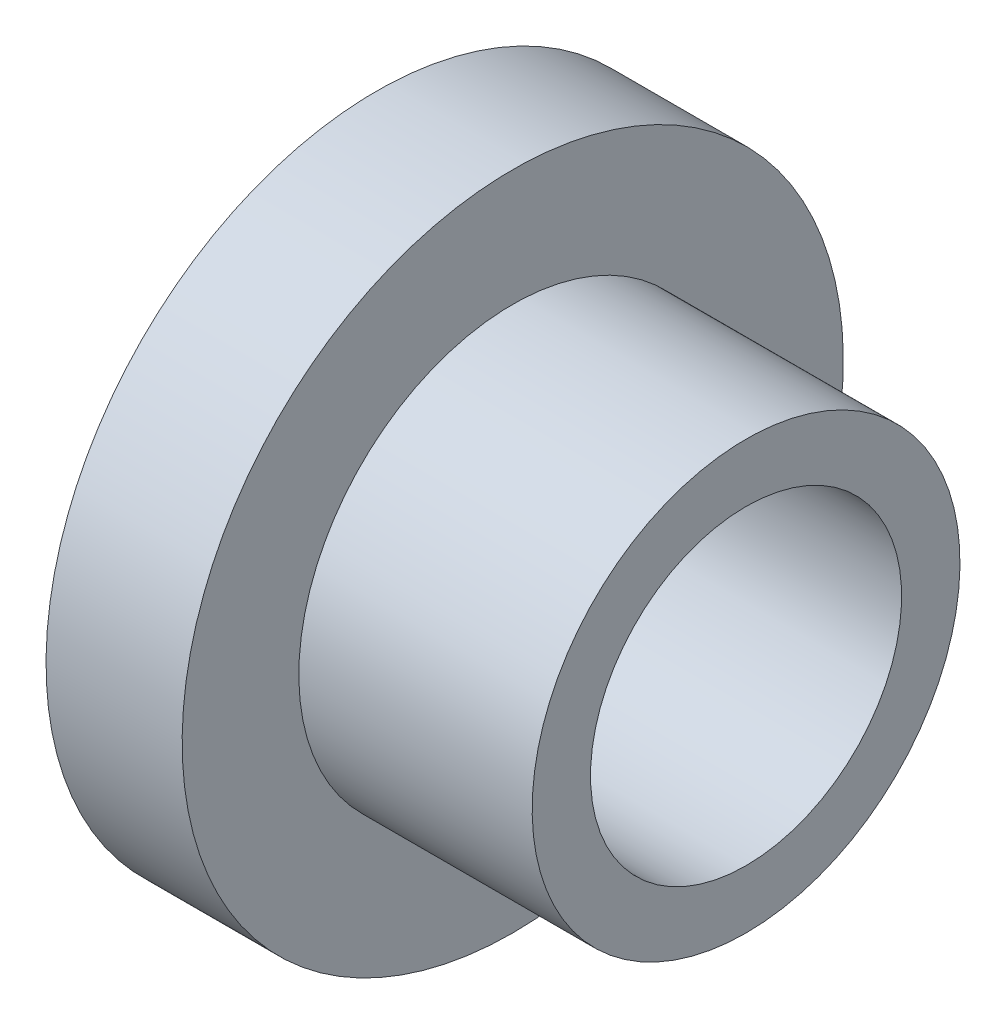
ISO-10303-21;
HEADER;
FILE_DESCRIPTION(('STEP AP214'),'2;1');
FILE_NAME('part.step','',(''),(''),'','','');
FILE_SCHEMA(('AUTOMOTIVE_DESIGN { 1 0 10303 214 1 1 1 1 }'));
ENDSEC;
DATA;
#1=APPLICATION_CONTEXT('core data for automotive mechanical design processes');
#2=APPLICATION_PROTOCOL_DEFINITION('international standard','automotive_design',2000,#1);
#3=PRODUCT_CONTEXT('',#1,'mechanical');
#4=PRODUCT('Part','Part','',(#3));
#5=PRODUCT_RELATED_PRODUCT_CATEGORY('part','',(#4));
#6=PRODUCT_DEFINITION_FORMATION('','',#4);
#7=PRODUCT_DEFINITION_CONTEXT('part definition',#1,'design');
#8=PRODUCT_DEFINITION('design','',#6,#7);
#9=PRODUCT_DEFINITION_SHAPE('','',#8);
#10=(LENGTH_UNIT() NAMED_UNIT(*) SI_UNIT(.MILLI.,.METRE.));
#11=(NAMED_UNIT(*) PLANE_ANGLE_UNIT() SI_UNIT($,.RADIAN.));
#12=(NAMED_UNIT(*) SI_UNIT($,.STERADIAN.) SOLID_ANGLE_UNIT());
#13=UNCERTAINTY_MEASURE_WITH_UNIT(LENGTH_MEASURE(1.E-05),#10,'distance_accuracy_value','');
#14=(GEOMETRIC_REPRESENTATION_CONTEXT(3) GLOBAL_UNCERTAINTY_ASSIGNED_CONTEXT((#13)) GLOBAL_UNIT_ASSIGNED_CONTEXT((#10,
#11,#12)) REPRESENTATION_CONTEXT('',''));
#15=CARTESIAN_POINT('',(0.,0.,0.));
#16=DIRECTION('',(0.,0.,1.));
#17=DIRECTION('',(1.,0.,0.));
#18=AXIS2_PLACEMENT_3D('',#15,#16,#17);
#19=CARTESIAN_POINT('',(-12.4999999999997,0.,0.));
#20=DIRECTION('',(-0.999999999999981,0.,0.));
#21=DIRECTION('',(0.,-1.,0.));
#22=AXIS2_PLACEMENT_3D('',#19,#20,#21);
#23=CYLINDRICAL_SURFACE('',#22,8.);
#24=CARTESIAN_POINT('',(-9.49999999999971,0.,0.));
#25=DIRECTION('',(-0.999999999999981,0.,0.));
#26=DIRECTION('',(0.,-1.,0.));
#27=AXIS2_PLACEMENT_3D('',#24,#25,#26);
#28=CIRCLE('',#27,8.);
#29=CARTESIAN_POINT('',(-9.49999999999971,-8.,0.));
#30=VERTEX_POINT('',#29);
#31=EDGE_CURVE('E48',#30,#30,#28,.T.);
#32=CARTESIAN_POINT('',(9.49999999999999,5.96744875736022E-13,0.));
#33=DIRECTION('',(-0.999999999999981,0.,0.));
#34=DIRECTION('',(0.,-1.,0.));
#35=AXIS2_PLACEMENT_3D('',#32,#33,#34);
#36=CIRCLE('',#35,8.);
#37=CARTESIAN_POINT('',(9.5,-8.,0.));
#38=VERTEX_POINT('',#37);
#39=EDGE_CURVE('E10',#38,#38,#36,.T.);
#40=CARTESIAN_POINT('',(-9.49999999999971,-8.,0.));
#41=CARTESIAN_POINT('',(-9.30208333333304,-8.,0.));
#42=CARTESIAN_POINT('',(-9.10416666666638,-8.,0.));
#43=CARTESIAN_POINT('',(-8.70833333333305,-8.,0.));
#44=CARTESIAN_POINT('',(-8.51041666666639,-8.,0.));
#45=CARTESIAN_POINT('',(-8.11458333333306,-8.,0.));
#46=CARTESIAN_POINT('',(-7.9166666666664,-8.,0.));
#47=CARTESIAN_POINT('',(-7.52083333333307,-8.,0.));
#48=CARTESIAN_POINT('',(-7.32291666666641,-8.,0.));
#49=CARTESIAN_POINT('',(-6.92708333333308,-8.,0.));
#50=CARTESIAN_POINT('',(-6.72916666666642,-8.,0.));
#51=CARTESIAN_POINT('',(-6.33333333333309,-8.,0.));
#52=CARTESIAN_POINT('',(-6.13541666666642,-8.,0.));
#53=CARTESIAN_POINT('',(-5.7395833333331,-8.,0.));
#54=CARTESIAN_POINT('',(-5.54166666666643,-8.,0.));
#55=CARTESIAN_POINT('',(-5.14583333333311,-8.,0.));
#56=CARTESIAN_POINT('',(-4.94791666666644,-8.,0.));
#57=CARTESIAN_POINT('',(-4.55208333333312,-8.,0.));
#58=CARTESIAN_POINT('',(-4.35416666666645,-8.,0.));
#59=CARTESIAN_POINT('',(-3.95833333333313,-8.,0.));
#60=CARTESIAN_POINT('',(-3.76041666666646,-8.,0.));
#61=CARTESIAN_POINT('',(-3.36458333333313,-8.,0.));
#62=CARTESIAN_POINT('',(-3.16666666666647,-8.,0.));
#63=CARTESIAN_POINT('',(-2.77083333333314,-8.,0.));
#64=CARTESIAN_POINT('',(-2.57291666666648,-8.,0.));
#65=CARTESIAN_POINT('',(-2.17708333333315,-8.,0.));
#66=CARTESIAN_POINT('',(-1.97916666666649,-8.,0.));
#67=CARTESIAN_POINT('',(-1.58333333333316,-8.,0.));
#68=CARTESIAN_POINT('',(-1.3854166666665,-8.,0.));
#69=CARTESIAN_POINT('',(-0.989583333333173,-8.,0.));
#70=CARTESIAN_POINT('',(-0.791666666666509,-8.,0.));
#71=CARTESIAN_POINT('',(-0.395833333333182,-8.,0.));
#72=CARTESIAN_POINT('',(-0.197916666666519,-8.,0.));
#73=CARTESIAN_POINT('',(0.197916666666808,-8.,0.));
#74=CARTESIAN_POINT('',(0.395833333333473,-8.,0.));
#75=CARTESIAN_POINT('',(0.7916666666668,-8.,0.));
#76=CARTESIAN_POINT('',(0.989583333333463,-8.,0.));
#77=CARTESIAN_POINT('',(1.38541666666679,-8.,0.));
#78=CARTESIAN_POINT('',(1.58333333333345,-8.,0.));
#79=CARTESIAN_POINT('',(1.97916666666678,-8.,0.));
#80=CARTESIAN_POINT('',(2.17708333333345,-8.,0.));
#81=CARTESIAN_POINT('',(2.57291666666677,-8.,0.));
#82=CARTESIAN_POINT('',(2.77083333333343,-8.,0.));
#83=CARTESIAN_POINT('',(3.16666666666676,-8.,0.));
#84=CARTESIAN_POINT('',(3.36458333333343,-8.,0.));
#85=CARTESIAN_POINT('',(3.76041666666675,-8.,0.));
#86=CARTESIAN_POINT('',(3.95833333333342,-8.,0.));
#87=CARTESIAN_POINT('',(4.35416666666674,-8.,0.));
#88=CARTESIAN_POINT('',(4.55208333333341,-8.,0.));
#89=CARTESIAN_POINT('',(4.94791666666674,-8.,0.));
#90=CARTESIAN_POINT('',(5.1458333333334,-8.,0.));
#91=CARTESIAN_POINT('',(5.54166666666673,-8.,0.));
#92=CARTESIAN_POINT('',(5.73958333333339,-8.,0.));
#93=CARTESIAN_POINT('',(6.13541666666672,-8.,0.));
#94=CARTESIAN_POINT('',(6.33333333333338,-8.,0.));
#95=CARTESIAN_POINT('',(6.72916666666671,-8.,0.));
#96=CARTESIAN_POINT('',(6.92708333333337,-8.,0.));
#97=CARTESIAN_POINT('',(7.3229166666667,-8.,0.));
#98=CARTESIAN_POINT('',(7.52083333333336,-8.,0.));
#99=CARTESIAN_POINT('',(7.91666666666669,-8.,0.));
#100=CARTESIAN_POINT('',(8.11458333333335,-8.,0.));
#101=CARTESIAN_POINT('',(8.51041666666668,-8.,0.));
#102=CARTESIAN_POINT('',(8.70833333333334,-8.,0.));
#103=CARTESIAN_POINT('',(9.10416666666667,-8.,0.));
#104=CARTESIAN_POINT('',(9.30208333333333,-8.,0.));
#105=CARTESIAN_POINT('',(9.5,-8.,0.));
#106=B_SPLINE_CURVE_WITH_KNOTS('',3,(#40,#41,#42,#43,#44,#45,#46,#47,#48,#49,#50,#51,#52,#53,
#54,#55,#56,#57,#58,#59,#60,#61,#62,#63,#64,#65,#66,#67,#68,#69,#70,#71,#72,#73,#74,#75,#76,#77,
#78,#79,#80,#81,#82,#83,#84,#85,#86,#87,#88,#89,#90,#91,#92,#93,#94,#95,#96,#97,#98,#99,#100,
#101,#102,#103,#104,#105),.UNSPECIFIED.,.F.,.F.,(4,2,2,2,2,2,2,2,2,2,2,2,2,2,2,2,2,2,2,2,2,2,2,
2,2,2,2,2,2,2,2,2,4),(0.,0.593749999999992,1.18749999999998,1.78124999999997,2.37499999999996,
2.96874999999996,3.56249999999995,4.15624999999994,4.74999999999993,5.34374999999992,
5.93749999999991,6.5312499999999,7.12499999999989,7.71874999999988,8.31249999999987,
8.90624999999986,9.49999999999985,10.0937499999998,10.6874999999998,11.2812499999998,
11.8749999999998,12.4687499999998,13.0624999999998,13.6562499999998,14.2499999999998,
14.8437499999998,15.4374999999998,16.0312499999997,16.6249999999997,17.2187499999997,
17.8124999999997,18.4062499999997,18.9999999999997),.UNSPECIFIED.);
#107=EDGE_CURVE('BSEAM26',#30,#38,#106,.T.);
#108=ORIENTED_EDGE('',*,*,#31,.T.);
#109=ORIENTED_EDGE('',*,*,#39,.F.);
#110=ORIENTED_EDGE('',*,*,#107,.T.);
#111=ORIENTED_EDGE('',*,*,#107,.F.);
#112=EDGE_LOOP('',(#108,#110,#109,#111));
#113=FACE_BOUND('',#112,.T.);
#114=ADVANCED_FACE('F26',(#113),#23,.F.);
#115=CARTESIAN_POINT('',(9.49999999999999,-7.9999999999997,0.));
#116=DIRECTION('',(0.999999999999981,0.,0.));
#117=DIRECTION('',(0.,1.,0.));
#118=AXIS2_PLACEMENT_3D('',#115,#116,#117);
#119=PLANE('',#118);
#120=ORIENTED_EDGE('',*,*,#39,.T.);
#121=EDGE_LOOP('',(#120));
#122=FACE_BOUND('',#121,.T.);
#123=CARTESIAN_POINT('',(9.49999999999999,5.96744875736022E-13,0.));
#124=DIRECTION('',(-0.999999999999981,0.,0.));
#125=DIRECTION('',(0.,-1.,0.));
#126=AXIS2_PLACEMENT_3D('',#123,#124,#125);
#127=CIRCLE('',#126,11.);
#128=CARTESIAN_POINT('',(9.5,-11.,0.));
#129=VERTEX_POINT('',#128);
#130=EDGE_CURVE('E32',#129,#129,#127,.T.);
#131=ORIENTED_EDGE('',*,*,#130,.F.);
#132=EDGE_LOOP('',(#131));
#133=FACE_BOUND('',#132,.T.);
#134=ADVANCED_FACE('F66',(#122,#133),#119,.T.);
#135=CARTESIAN_POINT('',(-12.4999999999997,0.,0.));
#136=DIRECTION('',(-0.999999999999981,0.,0.));
#137=DIRECTION('',(0.,-1.,0.));
#138=AXIS2_PLACEMENT_3D('',#135,#136,#137);
#139=CYLINDRICAL_SURFACE('',#138,11.);
#140=CARTESIAN_POINT('',(-2.5,0.,0.));
#141=DIRECTION('',(-0.999999999999981,0.,0.));
#142=DIRECTION('',(0.,-1.,0.));
#143=AXIS2_PLACEMENT_3D('',#140,#141,#142);
#144=CIRCLE('',#143,11.);
#145=CARTESIAN_POINT('',(-2.5,-11.,0.));
#146=VERTEX_POINT('',#145);
#147=EDGE_CURVE('E36',#146,#146,#144,.T.);
#148=CARTESIAN_POINT('',(9.5,-11.,0.));
#149=CARTESIAN_POINT('',(9.375,-11.,0.));
#150=CARTESIAN_POINT('',(9.25,-11.,0.));
#151=CARTESIAN_POINT('',(9.,-11.,0.));
#152=CARTESIAN_POINT('',(8.875,-11.,0.));
#153=CARTESIAN_POINT('',(8.62499999999999,-11.,0.));
#154=CARTESIAN_POINT('',(8.49999999999999,-11.,0.));
#155=CARTESIAN_POINT('',(8.24999999999999,-11.,0.));
#156=CARTESIAN_POINT('',(8.12499999999999,-11.,0.));
#157=CARTESIAN_POINT('',(7.87499999999999,-11.,0.));
#158=CARTESIAN_POINT('',(7.74999999999999,-11.,0.));
#159=CARTESIAN_POINT('',(7.49999999999999,-11.,0.));
#160=CARTESIAN_POINT('',(7.37499999999999,-11.,0.));
#161=CARTESIAN_POINT('',(7.12499999999999,-11.,0.));
#162=CARTESIAN_POINT('',(6.99999999999999,-11.,0.));
#163=CARTESIAN_POINT('',(6.74999999999999,-11.,0.));
#164=CARTESIAN_POINT('',(6.62499999999999,-11.,0.));
#165=CARTESIAN_POINT('',(6.37499999999999,-11.,0.));
#166=CARTESIAN_POINT('',(6.24999999999999,-11.,0.));
#167=CARTESIAN_POINT('',(6.,-11.,0.));
#168=CARTESIAN_POINT('',(5.875,-11.,0.));
#169=CARTESIAN_POINT('',(5.625,-11.,0.));
#170=CARTESIAN_POINT('',(5.5,-11.,0.));
#171=CARTESIAN_POINT('',(5.25,-11.,0.));
#172=CARTESIAN_POINT('',(5.125,-11.,0.));
#173=CARTESIAN_POINT('',(4.875,-11.,0.));
#174=CARTESIAN_POINT('',(4.75,-11.,0.));
#175=CARTESIAN_POINT('',(4.5,-11.,0.));
#176=CARTESIAN_POINT('',(4.375,-11.,0.));
#177=CARTESIAN_POINT('',(4.125,-11.,0.));
#178=CARTESIAN_POINT('',(4.,-11.,0.));
#179=CARTESIAN_POINT('',(3.75,-11.,0.));
#180=CARTESIAN_POINT('',(3.625,-11.,0.));
#181=CARTESIAN_POINT('',(3.375,-11.,0.));
#182=CARTESIAN_POINT('',(3.25,-11.,0.));
#183=CARTESIAN_POINT('',(3.,-11.,0.));
#184=CARTESIAN_POINT('',(2.875,-11.,0.));
#185=CARTESIAN_POINT('',(2.625,-11.,0.));
#186=CARTESIAN_POINT('',(2.5,-11.,0.));
#187=CARTESIAN_POINT('',(2.25,-11.,0.));
#188=CARTESIAN_POINT('',(2.125,-11.,0.));
#189=CARTESIAN_POINT('',(1.875,-11.,0.));
#190=CARTESIAN_POINT('',(1.75,-11.,0.));
#191=CARTESIAN_POINT('',(1.5,-11.,0.));
#192=CARTESIAN_POINT('',(1.375,-11.,0.));
#193=CARTESIAN_POINT('',(1.125,-11.,0.));
#194=CARTESIAN_POINT('',(0.999999999999999,-11.,0.));
#195=CARTESIAN_POINT('',(0.749999999999999,-11.,0.));
#196=CARTESIAN_POINT('',(0.624999999999999,-11.,0.));
#197=CARTESIAN_POINT('',(0.374999999999999,-11.,0.));
#198=CARTESIAN_POINT('',(0.249999999999999,-11.,0.));
#199=CARTESIAN_POINT('',(0.,-11.,0.));
#200=CARTESIAN_POINT('',(-0.125000000000002,-11.,0.));
#201=CARTESIAN_POINT('',(-0.375000000000002,-11.,0.));
#202=CARTESIAN_POINT('',(-0.500000000000002,-11.,0.));
#203=CARTESIAN_POINT('',(-0.750000000000002,-11.,0.));
#204=CARTESIAN_POINT('',(-0.875000000000001,-11.,0.));
#205=CARTESIAN_POINT('',(-1.125,-11.,0.));
#206=CARTESIAN_POINT('',(-1.25,-11.,0.));
#207=CARTESIAN_POINT('',(-1.5,-11.,0.));
#208=CARTESIAN_POINT('',(-1.625,-11.,0.));
#209=CARTESIAN_POINT('',(-1.875,-11.,0.));
#210=CARTESIAN_POINT('',(-2.,-11.,0.));
#211=CARTESIAN_POINT('',(-2.25,-11.,0.));
#212=CARTESIAN_POINT('',(-2.375,-11.,0.));
#213=CARTESIAN_POINT('',(-2.5,-11.,0.));
#214=B_SPLINE_CURVE_WITH_KNOTS('',3,(#148,#149,#150,#151,#152,#153,#154,#155,#156,#157,#158,
#159,#160,#161,#162,#163,#164,#165,#166,#167,#168,#169,#170,#171,#172,#173,#174,#175,#176,#177,
#178,#179,#180,#181,#182,#183,#184,#185,#186,#187,#188,#189,#190,#191,#192,#193,#194,#195,#196,
#197,#198,#199,#200,#201,#202,#203,#204,#205,#206,#207,#208,#209,#210,#211,#212,#213),
.UNSPECIFIED.,.F.,.F.,(4,2,2,2,2,2,2,2,2,2,2,2,2,2,2,2,2,2,2,2,2,2,2,2,2,2,2,2,2,2,2,2,4),(0.,
0.375,0.750000000000001,1.125,1.5,1.875,2.25,2.625,3.,3.375,3.75,4.125,4.5,4.875,5.25,5.625,6.,
6.375,6.75,7.125,7.5,7.875,8.25,8.625,9.,9.375,9.75,10.125,10.5,10.875,11.25,11.625,12.),.UNSPECIFIED.);
#215=EDGE_CURVE('BSEAM70',#129,#146,#214,.T.);
#216=ORIENTED_EDGE('',*,*,#130,.T.);
#217=ORIENTED_EDGE('',*,*,#147,.F.);
#218=ORIENTED_EDGE('',*,*,#215,.T.);
#219=ORIENTED_EDGE('',*,*,#215,.F.);
#220=EDGE_LOOP('',(#216,#218,#217,#219));
#221=FACE_BOUND('',#220,.T.);
#222=ADVANCED_FACE('F70',(#221),#139,.T.);
#223=CARTESIAN_POINT('',(-2.49999999999985,-10.9999999999997,0.));
#224=DIRECTION('',(0.999999999999981,0.,0.));
#225=DIRECTION('',(0.,1.,0.));
#226=AXIS2_PLACEMENT_3D('',#223,#224,#225);
#227=PLANE('',#226);
#228=ORIENTED_EDGE('',*,*,#147,.T.);
#229=EDGE_LOOP('',(#228));
#230=FACE_BOUND('',#229,.T.);
#231=CARTESIAN_POINT('',(-2.5,0.,0.));
#232=DIRECTION('',(-0.999999999999981,0.,0.));
#233=DIRECTION('',(0.,-1.,0.));
#234=AXIS2_PLACEMENT_3D('',#231,#232,#233);
#235=CIRCLE('',#234,17.);
#236=CARTESIAN_POINT('',(-2.5,-17.,0.));
#237=VERTEX_POINT('',#236);
#238=EDGE_CURVE('E40',#237,#237,#235,.T.);
#239=ORIENTED_EDGE('',*,*,#238,.F.);
#240=EDGE_LOOP('',(#239));
#241=FACE_BOUND('',#240,.T.);
#242=ADVANCED_FACE('F62',(#230,#241),#227,.T.);
#243=CARTESIAN_POINT('',(-12.4999999999997,0.,0.));
#244=DIRECTION('',(-0.999999999999981,0.,0.));
#245=DIRECTION('',(0.,-1.,0.));
#246=AXIS2_PLACEMENT_3D('',#243,#244,#245);
#247=CYLINDRICAL_SURFACE('',#246,17.);
#248=CARTESIAN_POINT('',(-9.49999999999971,0.,0.));
#249=DIRECTION('',(-0.999999999999981,0.,0.));
#250=DIRECTION('',(0.,-1.,0.));
#251=AXIS2_PLACEMENT_3D('',#248,#249,#250);
#252=CIRCLE('',#251,17.);
#253=CARTESIAN_POINT('',(-9.4999999999997,-17.,0.));
#254=VERTEX_POINT('',#253);
#255=EDGE_CURVE('E45',#254,#254,#252,.T.);
#256=CARTESIAN_POINT('',(-2.5,-17.,0.));
#257=CARTESIAN_POINT('',(-2.57291666666666,-17.,0.));
#258=CARTESIAN_POINT('',(-2.64583333333333,-17.,0.));
#259=CARTESIAN_POINT('',(-2.79166666666665,-17.,0.));
#260=CARTESIAN_POINT('',(-2.86458333333332,-17.,0.));
#261=CARTESIAN_POINT('',(-3.01041666666664,-17.,0.));
#262=CARTESIAN_POINT('',(-3.08333333333331,-17.,0.));
#263=CARTESIAN_POINT('',(-3.22916666666663,-17.,0.));
#264=CARTESIAN_POINT('',(-3.3020833333333,-17.,0.));
#265=CARTESIAN_POINT('',(-3.44791666666663,-17.,0.));
#266=CARTESIAN_POINT('',(-3.52083333333329,-17.,0.));
#267=CARTESIAN_POINT('',(-3.66666666666662,-17.,0.));
#268=CARTESIAN_POINT('',(-3.73958333333328,-17.,0.));
#269=CARTESIAN_POINT('',(-3.88541666666661,-17.,0.));
#270=CARTESIAN_POINT('',(-3.95833333333327,-17.,0.));
#271=CARTESIAN_POINT('',(-4.1041666666666,-17.,0.));
#272=CARTESIAN_POINT('',(-4.17708333333326,-17.,0.));
#273=CARTESIAN_POINT('',(-4.32291666666659,-17.,0.));
#274=CARTESIAN_POINT('',(-4.39583333333325,-17.,0.));
#275=CARTESIAN_POINT('',(-4.54166666666658,-17.,0.));
#276=CARTESIAN_POINT('',(-4.61458333333324,-17.,0.));
#277=CARTESIAN_POINT('',(-4.76041666666657,-17.,0.));
#278=CARTESIAN_POINT('',(-4.83333333333323,-17.,0.));
#279=CARTESIAN_POINT('',(-4.97916666666656,-17.,0.));
#280=CARTESIAN_POINT('',(-5.05208333333322,-17.,0.));
#281=CARTESIAN_POINT('',(-5.19791666666655,-17.,0.));
#282=CARTESIAN_POINT('',(-5.27083333333322,-17.,0.));
#283=CARTESIAN_POINT('',(-5.41666666666654,-17.,0.));
#284=CARTESIAN_POINT('',(-5.48958333333321,-17.,0.));
#285=CARTESIAN_POINT('',(-5.63541666666653,-17.,0.));
#286=CARTESIAN_POINT('',(-5.7083333333332,-17.,0.));
#287=CARTESIAN_POINT('',(-5.85416666666652,-17.,0.));
#288=CARTESIAN_POINT('',(-5.92708333333319,-17.,0.));
#289=CARTESIAN_POINT('',(-6.07291666666652,-17.,0.));
#290=CARTESIAN_POINT('',(-6.14583333333318,-17.,0.));
#291=CARTESIAN_POINT('',(-6.29166666666651,-17.,0.));
#292=CARTESIAN_POINT('',(-6.36458333333317,-17.,0.));
#293=CARTESIAN_POINT('',(-6.5104166666665,-17.,0.));
#294=CARTESIAN_POINT('',(-6.58333333333316,-17.,0.));
#295=CARTESIAN_POINT('',(-6.72916666666649,-17.,0.));
#296=CARTESIAN_POINT('',(-6.80208333333315,-17.,0.));
#297=CARTESIAN_POINT('',(-6.94791666666648,-17.,0.));
#298=CARTESIAN_POINT('',(-7.02083333333314,-17.,0.));
#299=CARTESIAN_POINT('',(-7.16666666666647,-17.,0.));
#300=CARTESIAN_POINT('',(-7.23958333333313,-17.,0.));
#301=CARTESIAN_POINT('',(-7.38541666666646,-17.,0.));
#302=CARTESIAN_POINT('',(-7.45833333333312,-17.,0.));
#303=CARTESIAN_POINT('',(-7.60416666666645,-17.,0.));
#304=CARTESIAN_POINT('',(-7.67708333333311,-17.,0.));
#305=CARTESIAN_POINT('',(-7.82291666666644,-17.,0.));
#306=CARTESIAN_POINT('',(-7.8958333333331,-17.,0.));
#307=CARTESIAN_POINT('',(-8.04166666666643,-17.,0.));
#308=CARTESIAN_POINT('',(-8.1145833333331,-17.,0.));
#309=CARTESIAN_POINT('',(-8.26041666666642,-17.,0.));
#310=CARTESIAN_POINT('',(-8.33333333333309,-17.,0.));
#311=CARTESIAN_POINT('',(-8.47916666666641,-17.,0.));
#312=CARTESIAN_POINT('',(-8.55208333333308,-17.,0.));
#313=CARTESIAN_POINT('',(-8.6979166666664,-17.,0.));
#314=CARTESIAN_POINT('',(-8.77083333333307,-17.,0.));
#315=CARTESIAN_POINT('',(-8.9166666666664,-17.,0.));
#316=CARTESIAN_POINT('',(-8.98958333333306,-17.,0.));
#317=CARTESIAN_POINT('',(-9.13541666666639,-17.,0.));
#318=CARTESIAN_POINT('',(-9.20833333333305,-17.,0.));
#319=CARTESIAN_POINT('',(-9.35416666666638,-17.,0.));
#320=CARTESIAN_POINT('',(-9.42708333333304,-17.,0.));
#321=CARTESIAN_POINT('',(-9.4999999999997,-17.,0.));
#322=B_SPLINE_CURVE_WITH_KNOTS('',3,(#256,#257,#258,#259,#260,#261,#262,#263,#264,#265,#266,
#267,#268,#269,#270,#271,#272,#273,#274,#275,#276,#277,#278,#279,#280,#281,#282,#283,#284,#285,
#286,#287,#288,#289,#290,#291,#292,#293,#294,#295,#296,#297,#298,#299,#300,#301,#302,#303,#304,
#305,#306,#307,#308,#309,#310,#311,#312,#313,#314,#315,#316,#317,#318,#319,#320,#321),
.UNSPECIFIED.,.F.,.F.,(4,2,2,2,2,2,2,2,2,2,2,2,2,2,2,2,2,2,2,2,2,2,2,2,2,2,2,2,2,2,2,2,4),(0.,
0.218749999999992,0.437499999999981,0.656249999999973,0.874999999999963,1.09374999999995,
1.31249999999995,1.53124999999994,1.74999999999993,1.96874999999992,2.18749999999991,
2.4062499999999,2.62499999999989,2.84374999999988,3.06249999999987,3.28124999999986,
3.49999999999985,3.71874999999984,3.93749999999983,4.15624999999983,4.37499999999982,
4.59374999999981,4.8124999999998,5.03124999999979,5.24999999999978,5.46874999999977,
5.68749999999976,5.90624999999975,6.12499999999974,6.34374999999973,6.56249999999972,
6.78124999999971,6.9999999999997),.UNSPECIFIED.);
#323=EDGE_CURVE('BSEAM56',#237,#254,#322,.T.);
#324=ORIENTED_EDGE('',*,*,#238,.T.);
#325=ORIENTED_EDGE('',*,*,#255,.F.);
#326=ORIENTED_EDGE('',*,*,#323,.T.);
#327=ORIENTED_EDGE('',*,*,#323,.F.);
#328=EDGE_LOOP('',(#324,#326,#325,#327));
#329=FACE_BOUND('',#328,.T.);
#330=ADVANCED_FACE('F56',(#329),#247,.T.);
#331=CARTESIAN_POINT('',(-9.4999999999997,-16.9999999999997,0.));
#332=DIRECTION('',(-0.999999999999981,0.,0.));
#333=DIRECTION('',(0.,-1.,0.));
#334=AXIS2_PLACEMENT_3D('',#331,#332,#333);
#335=PLANE('',#334);
#336=ORIENTED_EDGE('',*,*,#255,.T.);
#337=EDGE_LOOP('',(#336));
#338=FACE_BOUND('',#337,.T.);
#339=ORIENTED_EDGE('',*,*,#31,.F.);
#340=EDGE_LOOP('',(#339));
#341=FACE_BOUND('',#340,.T.);
#342=ADVANCED_FACE('F54',(#338,#341),#335,.T.);
#343=CLOSED_SHELL('',(#114,#134,#222,#242,#330,#342));
#344=MANIFOLD_SOLID_BREP('B2',#343);
#345=ADVANCED_BREP_SHAPE_REPRESENTATION('',(#18,#344),#14);
#346=SHAPE_DEFINITION_REPRESENTATION(#9,#345);
ENDSEC;
END-ISO-10303-21;
